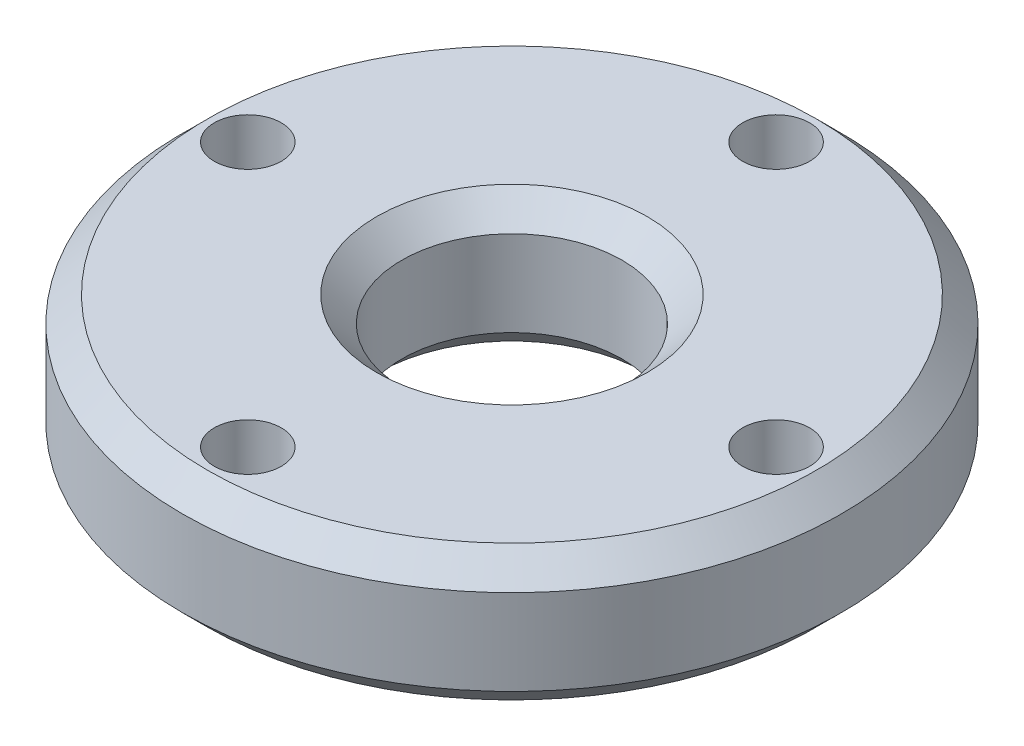
ISO-10303-21;
HEADER;
FILE_DESCRIPTION(('STEP AP214'),'2;1');
FILE_NAME('part.step','',(''),(''),'','','');
FILE_SCHEMA(('AUTOMOTIVE_DESIGN { 1 0 10303 214 1 1 1 1 }'));
ENDSEC;
DATA;
#1=APPLICATION_CONTEXT('core data for automotive mechanical design processes');
#2=APPLICATION_PROTOCOL_DEFINITION('international standard','automotive_design',2000,#1);
#3=PRODUCT_CONTEXT('',#1,'mechanical');
#4=PRODUCT('Part','Part','',(#3));
#5=PRODUCT_RELATED_PRODUCT_CATEGORY('part','',(#4));
#6=PRODUCT_DEFINITION_FORMATION('','',#4);
#7=PRODUCT_DEFINITION_CONTEXT('part definition',#1,'design');
#8=PRODUCT_DEFINITION('design','',#6,#7);
#9=PRODUCT_DEFINITION_SHAPE('','',#8);
#10=(LENGTH_UNIT() NAMED_UNIT(*) SI_UNIT(.MILLI.,.METRE.));
#11=(NAMED_UNIT(*) PLANE_ANGLE_UNIT() SI_UNIT($,.RADIAN.));
#12=(NAMED_UNIT(*) SI_UNIT($,.STERADIAN.) SOLID_ANGLE_UNIT());
#13=UNCERTAINTY_MEASURE_WITH_UNIT(LENGTH_MEASURE(1.E-05),#10,'distance_accuracy_value','');
#14=(GEOMETRIC_REPRESENTATION_CONTEXT(3) GLOBAL_UNCERTAINTY_ASSIGNED_CONTEXT((#13)) GLOBAL_UNIT_ASSIGNED_CONTEXT((#10,
#11,#12)) REPRESENTATION_CONTEXT('',''));
#15=CARTESIAN_POINT('',(0.,0.,0.));
#16=DIRECTION('',(0.,0.,1.));
#17=DIRECTION('',(1.,0.,0.));
#18=AXIS2_PLACEMENT_3D('',#15,#16,#17);
#19=CARTESIAN_POINT('',(0.,13.716,0.));
#20=DIRECTION('',(0.,1.,0.));
#21=DIRECTION('',(0.,0.,1.));
#22=AXIS2_PLACEMENT_3D('',#19,#20,#21);
#23=PLANE('',#22);
#24=CARTESIAN_POINT('',(0.,13.716,0.));
#25=DIRECTION('',(0.,1.,0.));
#26=DIRECTION('',(0.,0.,1.));
#27=AXIS2_PLACEMENT_3D('',#24,#25,#26);
#28=CIRCLE('',#27,13.6525);
#29=CARTESIAN_POINT('',(0.,13.716,13.6525));
#30=VERTEX_POINT('',#29);
#31=EDGE_CURVE('E44',#30,#30,#28,.F.);
#32=ORIENTED_EDGE('',*,*,#31,.T.);
#33=EDGE_LOOP('',(#32));
#34=FACE_BOUND('',#33,.T.);
#35=CARTESIAN_POINT('',(0.,13.716,0.));
#36=DIRECTION('',(0.,1.,0.));
#37=DIRECTION('',(0.,0.,1.));
#38=AXIS2_PLACEMENT_3D('',#35,#36,#37);
#39=CIRCLE('',#38,30.734);
#40=CARTESIAN_POINT('',(0.,13.716,30.734));
#41=VERTEX_POINT('',#40);
#42=EDGE_CURVE('E48',#41,#41,#39,.T.);
#43=ORIENTED_EDGE('',*,*,#42,.T.);
#44=EDGE_LOOP('',(#43));
#45=FACE_BOUND('',#44,.T.);
#46=CARTESIAN_POINT('',(1.5094817149911E-12,13.716,26.67));
#47=DIRECTION('',(0.,1.,0.));
#48=DIRECTION('',(0.,0.,1.));
#49=AXIS2_PLACEMENT_3D('',#46,#47,#48);
#50=CIRCLE('',#49,3.37820000000162);
#51=CARTESIAN_POINT('',(1.5094817149911E-12,13.716,30.0482000000016));
#52=VERTEX_POINT('',#51);
#53=EDGE_CURVE('E75',#52,#52,#50,.T.);
#54=ORIENTED_EDGE('',*,*,#53,.F.);
#55=EDGE_LOOP('',(#54));
#56=FACE_BOUND('',#55,.T.);
#57=CARTESIAN_POINT('',(0.,13.716,-26.67));
#58=DIRECTION('',(0.,1.,0.));
#59=DIRECTION('',(0.,0.,1.));
#60=AXIS2_PLACEMENT_3D('',#57,#58,#59);
#61=CIRCLE('',#60,3.3782);
#62=CARTESIAN_POINT('',(0.,13.716,-23.2918));
#63=VERTEX_POINT('',#62);
#64=EDGE_CURVE('E65',#63,#63,#61,.T.);
#65=ORIENTED_EDGE('',*,*,#64,.F.);
#66=EDGE_LOOP('',(#65));
#67=FACE_BOUND('',#66,.T.);
#68=CARTESIAN_POINT('',(26.6700000000008,13.716,-7.54740857495549E-13));
#69=DIRECTION('',(0.,1.,0.));
#70=DIRECTION('',(0.,0.,1.));
#71=AXIS2_PLACEMENT_3D('',#68,#69,#70);
#72=CIRCLE('',#71,3.37820000000059);
#73=CARTESIAN_POINT('',(26.6700000000008,13.716,3.37819999999984));
#74=VERTEX_POINT('',#73);
#75=EDGE_CURVE('E69',#74,#74,#72,.T.);
#76=ORIENTED_EDGE('',*,*,#75,.F.);
#77=EDGE_LOOP('',(#76));
#78=FACE_BOUND('',#77,.T.);
#79=CARTESIAN_POINT('',(-26.6699999999992,13.716,7.58006990508875E-13));
#80=DIRECTION('',(0.,1.,0.));
#81=DIRECTION('',(0.,0.,1.));
#82=AXIS2_PLACEMENT_3D('',#79,#80,#81);
#83=CIRCLE('',#82,3.37820000000121);
#84=CARTESIAN_POINT('',(-26.6699999999992,13.716,3.37820000000197));
#85=VERTEX_POINT('',#84);
#86=EDGE_CURVE('E81',#85,#85,#83,.T.);
#87=ORIENTED_EDGE('',*,*,#86,.F.);
#88=EDGE_LOOP('',(#87));
#89=FACE_BOUND('',#88,.T.);
#90=ADVANCED_FACE('F33',(#34,#45,#56,#67,#78,#89),#23,.T.);
#91=CARTESIAN_POINT('',(0.,0.,0.));
#92=DIRECTION('',(0.,1.,0.));
#93=DIRECTION('',(0.,0.,1.));
#94=AXIS2_PLACEMENT_3D('',#91,#92,#93);
#95=PLANE('',#94);
#96=CARTESIAN_POINT('',(0.,0.,0.));
#97=DIRECTION('',(0.,1.,0.));
#98=DIRECTION('',(0.,0.,1.));
#99=AXIS2_PLACEMENT_3D('',#96,#97,#98);
#100=CIRCLE('',#99,13.6525);
#101=CARTESIAN_POINT('',(0.,0.,13.6525));
#102=VERTEX_POINT('',#101);
#103=EDGE_CURVE('E59',#102,#102,#100,.T.);
#104=ORIENTED_EDGE('',*,*,#103,.T.);
#105=EDGE_LOOP('',(#104));
#106=FACE_BOUND('',#105,.T.);
#107=CARTESIAN_POINT('',(0.,0.,0.));
#108=DIRECTION('',(0.,1.,0.));
#109=DIRECTION('',(0.,0.,1.));
#110=AXIS2_PLACEMENT_3D('',#107,#108,#109);
#111=CIRCLE('',#110,30.734);
#112=CARTESIAN_POINT('',(0.,0.,30.734));
#113=VERTEX_POINT('',#112);
#114=EDGE_CURVE('E62',#113,#113,#111,.F.);
#115=ORIENTED_EDGE('',*,*,#114,.T.);
#116=EDGE_LOOP('',(#115));
#117=FACE_BOUND('',#116,.T.);
#118=CARTESIAN_POINT('',(1.5094817149911E-12,0.,26.67));
#119=DIRECTION('',(0.,1.,0.));
#120=DIRECTION('',(0.,0.,1.));
#121=AXIS2_PLACEMENT_3D('',#118,#119,#120);
#122=CIRCLE('',#121,3.37820000000162);
#123=CARTESIAN_POINT('',(1.5094817149911E-12,0.,30.0482000000016));
#124=VERTEX_POINT('',#123);
#125=EDGE_CURVE('E78',#124,#124,#122,.T.);
#126=ORIENTED_EDGE('',*,*,#125,.T.);
#127=EDGE_LOOP('',(#126));
#128=FACE_BOUND('',#127,.T.);
#129=CARTESIAN_POINT('',(0.,0.,-26.67));
#130=DIRECTION('',(0.,1.,0.));
#131=DIRECTION('',(0.,0.,1.));
#132=AXIS2_PLACEMENT_3D('',#129,#130,#131);
#133=CIRCLE('',#132,3.3782);
#134=CARTESIAN_POINT('',(0.,0.,-23.2918));
#135=VERTEX_POINT('',#134);
#136=EDGE_CURVE('E66',#135,#135,#133,.T.);
#137=ORIENTED_EDGE('',*,*,#136,.T.);
#138=EDGE_LOOP('',(#137));
#139=FACE_BOUND('',#138,.T.);
#140=CARTESIAN_POINT('',(26.6700000000008,0.,-7.54740857495549E-13));
#141=DIRECTION('',(0.,1.,0.));
#142=DIRECTION('',(0.,0.,1.));
#143=AXIS2_PLACEMENT_3D('',#140,#141,#142);
#144=CIRCLE('',#143,3.37820000000059);
#145=CARTESIAN_POINT('',(26.6700000000008,0.,3.37819999999984));
#146=VERTEX_POINT('',#145);
#147=EDGE_CURVE('E72',#146,#146,#144,.T.);
#148=ORIENTED_EDGE('',*,*,#147,.T.);
#149=EDGE_LOOP('',(#148));
#150=FACE_BOUND('',#149,.T.);
#151=CARTESIAN_POINT('',(-26.6699999999992,0.,7.58006990508875E-13));
#152=DIRECTION('',(0.,1.,0.));
#153=DIRECTION('',(0.,0.,1.));
#154=AXIS2_PLACEMENT_3D('',#151,#152,#153);
#155=CIRCLE('',#154,3.37820000000121);
#156=CARTESIAN_POINT('',(-26.6699999999992,0.,3.37820000000197));
#157=VERTEX_POINT('',#156);
#158=EDGE_CURVE('E84',#157,#157,#155,.T.);
#159=ORIENTED_EDGE('',*,*,#158,.T.);
#160=EDGE_LOOP('',(#159));
#161=FACE_BOUND('',#160,.T.);
#162=ADVANCED_FACE('F94',(#106,#117,#128,#139,#150,#161),#95,.F.);
#163=CARTESIAN_POINT('',(0.,13.716,0.));
#164=DIRECTION('',(0.,-1.,0.));
#165=DIRECTION('',(0.,0.,-1.));
#166=AXIS2_PLACEMENT_3D('',#163,#164,#165);
#167=CYLINDRICAL_SURFACE('',#166,33.274);
#168=CARTESIAN_POINT('',(0.,2.54000000000001,0.));
#169=DIRECTION('',(0.,1.,0.));
#170=DIRECTION('',(0.,0.,1.));
#171=AXIS2_PLACEMENT_3D('',#168,#169,#170);
#172=CIRCLE('',#171,33.274);
#173=CARTESIAN_POINT('',(0.,2.54000000000001,33.274));
#174=VERTEX_POINT('',#173);
#175=EDGE_CURVE('E10',#174,#174,#172,.T.);
#176=ORIENTED_EDGE('',*,*,#175,.T.);
#177=EDGE_LOOP('',(#176));
#178=FACE_BOUND('',#177,.T.);
#179=CARTESIAN_POINT('',(0.,11.176,0.));
#180=DIRECTION('',(0.,1.,0.));
#181=DIRECTION('',(0.,0.,1.));
#182=AXIS2_PLACEMENT_3D('',#179,#180,#181);
#183=CIRCLE('',#182,33.274);
#184=CARTESIAN_POINT('',(0.,11.176,33.274));
#185=VERTEX_POINT('',#184);
#186=EDGE_CURVE('E40',#185,#185,#183,.F.);
#187=ORIENTED_EDGE('',*,*,#186,.T.);
#188=EDGE_LOOP('',(#187));
#189=FACE_BOUND('',#188,.T.);
#190=ADVANCED_FACE('F100',(#178,#189),#167,.T.);
#191=CARTESIAN_POINT('',(0.,13.716,0.));
#192=DIRECTION('',(0.,-1.,0.));
#193=DIRECTION('',(0.,0.,-1.));
#194=AXIS2_PLACEMENT_3D('',#191,#192,#193);
#195=CYLINDRICAL_SURFACE('',#194,11.1125);
#196=CARTESIAN_POINT('',(0.,2.54,0.));
#197=DIRECTION('',(0.,1.,0.));
#198=DIRECTION('',(0.,0.,1.));
#199=AXIS2_PLACEMENT_3D('',#196,#197,#198);
#200=CIRCLE('',#199,11.1125);
#201=CARTESIAN_POINT('',(0.,2.54,11.1125));
#202=VERTEX_POINT('',#201);
#203=EDGE_CURVE('E53',#202,#202,#200,.F.);
#204=ORIENTED_EDGE('',*,*,#203,.T.);
#205=EDGE_LOOP('',(#204));
#206=FACE_BOUND('',#205,.T.);
#207=CARTESIAN_POINT('',(0.,11.176,0.));
#208=DIRECTION('',(0.,1.,0.));
#209=DIRECTION('',(0.,0.,1.));
#210=AXIS2_PLACEMENT_3D('',#207,#208,#209);
#211=CIRCLE('',#210,11.1125);
#212=CARTESIAN_POINT('',(0.,11.176,11.1125));
#213=VERTEX_POINT('',#212);
#214=EDGE_CURVE('E56',#213,#213,#211,.T.);
#215=ORIENTED_EDGE('',*,*,#214,.T.);
#216=EDGE_LOOP('',(#215));
#217=FACE_BOUND('',#216,.T.);
#218=ADVANCED_FACE('F105',(#206,#217),#195,.F.);
#219=CARTESIAN_POINT('',(0.,13.716,-26.67));
#220=DIRECTION('',(0.,-1.,0.));
#221=DIRECTION('',(0.,0.,-1.));
#222=AXIS2_PLACEMENT_3D('',#219,#220,#221);
#223=CYLINDRICAL_SURFACE('',#222,3.3782);
#224=ORIENTED_EDGE('',*,*,#64,.T.);
#225=EDGE_LOOP('',(#224));
#226=FACE_BOUND('',#225,.T.);
#227=ORIENTED_EDGE('',*,*,#136,.F.);
#228=EDGE_LOOP('',(#227));
#229=FACE_BOUND('',#228,.T.);
#230=ADVANCED_FACE('F146',(#226,#229),#223,.F.);
#231=CARTESIAN_POINT('',(26.6700000000008,13.716,-7.54740857495549E-13));
#232=DIRECTION('',(0.,-1.,0.));
#233=DIRECTION('',(0.,0.,-1.));
#234=AXIS2_PLACEMENT_3D('',#231,#232,#233);
#235=CYLINDRICAL_SURFACE('',#234,3.37820000000059);
#236=ORIENTED_EDGE('',*,*,#75,.T.);
#237=EDGE_LOOP('',(#236));
#238=FACE_BOUND('',#237,.T.);
#239=ORIENTED_EDGE('',*,*,#147,.F.);
#240=EDGE_LOOP('',(#239));
#241=FACE_BOUND('',#240,.T.);
#242=ADVANCED_FACE('F141',(#238,#241),#235,.F.);
#243=CARTESIAN_POINT('',(1.5094817149911E-12,13.716,26.67));
#244=DIRECTION('',(0.,-1.,0.));
#245=DIRECTION('',(0.,0.,-1.));
#246=AXIS2_PLACEMENT_3D('',#243,#244,#245);
#247=CYLINDRICAL_SURFACE('',#246,3.37820000000162);
#248=ORIENTED_EDGE('',*,*,#53,.T.);
#249=EDGE_LOOP('',(#248));
#250=FACE_BOUND('',#249,.T.);
#251=ORIENTED_EDGE('',*,*,#125,.F.);
#252=EDGE_LOOP('',(#251));
#253=FACE_BOUND('',#252,.T.);
#254=ADVANCED_FACE('F136',(#250,#253),#247,.F.);
#255=CARTESIAN_POINT('',(-26.6699999999992,13.716,7.58006990508875E-13));
#256=DIRECTION('',(0.,-1.,0.));
#257=DIRECTION('',(0.,0.,-1.));
#258=AXIS2_PLACEMENT_3D('',#255,#256,#257);
#259=CYLINDRICAL_SURFACE('',#258,3.37820000000121);
#260=ORIENTED_EDGE('',*,*,#86,.T.);
#261=EDGE_LOOP('',(#260));
#262=FACE_BOUND('',#261,.T.);
#263=ORIENTED_EDGE('',*,*,#158,.F.);
#264=EDGE_LOOP('',(#263));
#265=FACE_BOUND('',#264,.T.);
#266=ADVANCED_FACE('F90',(#262,#265),#259,.F.);
#267=CARTESIAN_POINT('',(0.,0.,0.));
#268=DIRECTION('',(0.,-1.,0.));
#269=DIRECTION('',(0.,0.,-1.));
#270=AXIS2_PLACEMENT_3D('',#267,#268,#269);
#271=CONICAL_SURFACE('',#270,13.6525,0.785398163397445);
#272=ORIENTED_EDGE('',*,*,#203,.F.);
#273=EDGE_LOOP('',(#272));
#274=FACE_BOUND('',#273,.T.);
#275=ORIENTED_EDGE('',*,*,#103,.F.);
#276=EDGE_LOOP('',(#275));
#277=FACE_BOUND('',#276,.T.);
#278=ADVANCED_FACE('F110',(#274,#277),#271,.F.);
#279=CARTESIAN_POINT('',(0.,11.176,0.));
#280=DIRECTION('',(0.,1.,0.));
#281=DIRECTION('',(0.,0.,1.));
#282=AXIS2_PLACEMENT_3D('',#279,#280,#281);
#283=CONICAL_SURFACE('',#282,11.1125,0.785398163397449);
#284=ORIENTED_EDGE('',*,*,#31,.F.);
#285=EDGE_LOOP('',(#284));
#286=FACE_BOUND('',#285,.T.);
#287=ORIENTED_EDGE('',*,*,#214,.F.);
#288=EDGE_LOOP('',(#287));
#289=FACE_BOUND('',#288,.T.);
#290=ADVANCED_FACE('F113',(#286,#289),#283,.F.);
#291=CARTESIAN_POINT('',(0.,2.54000000000001,0.));
#292=DIRECTION('',(0.,1.,0.));
#293=DIRECTION('',(0.,0.,1.));
#294=AXIS2_PLACEMENT_3D('',#291,#292,#293);
#295=CONICAL_SURFACE('',#294,33.274,0.78539816339745);
#296=ORIENTED_EDGE('',*,*,#114,.F.);
#297=EDGE_LOOP('',(#296));
#298=FACE_BOUND('',#297,.T.);
#299=ORIENTED_EDGE('',*,*,#175,.F.);
#300=EDGE_LOOP('',(#299));
#301=FACE_BOUND('',#300,.T.);
#302=ADVANCED_FACE('F116',(#298,#301),#295,.T.);
#303=CARTESIAN_POINT('',(0.,13.716,0.));
#304=DIRECTION('',(0.,-1.,0.));
#305=DIRECTION('',(0.,0.,-1.));
#306=AXIS2_PLACEMENT_3D('',#303,#304,#305);
#307=CONICAL_SURFACE('',#306,30.734,0.785398163397447);
#308=ORIENTED_EDGE('',*,*,#186,.F.);
#309=EDGE_LOOP('',(#308));
#310=FACE_BOUND('',#309,.T.);
#311=ORIENTED_EDGE('',*,*,#42,.F.);
#312=EDGE_LOOP('',(#311));
#313=FACE_BOUND('',#312,.T.);
#314=ADVANCED_FACE('F35',(#310,#313),#307,.T.);
#315=CLOSED_SHELL('',(#90,#162,#190,#218,#230,#242,#254,#266,#278,#290,#302,#314));
#316=MANIFOLD_SOLID_BREP('B2',#315);
#317=ADVANCED_BREP_SHAPE_REPRESENTATION('',(#18,#316),#14);
#318=SHAPE_DEFINITION_REPRESENTATION(#9,#317);
ENDSEC;
END-ISO-10303-21;
